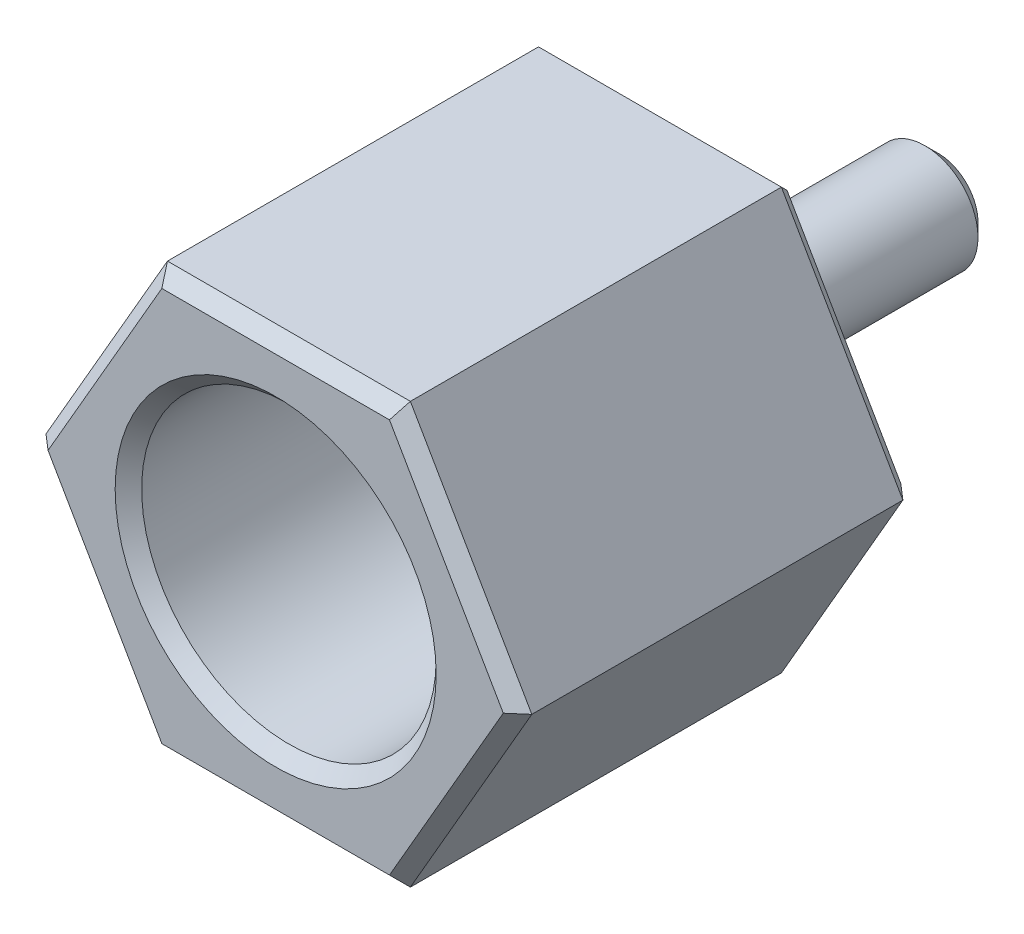
ISO-10303-21;
HEADER;
FILE_DESCRIPTION(('STEP AP214'),'2;1');
FILE_NAME('part.step','',(''),(''),'','','');
FILE_SCHEMA(('AUTOMOTIVE_DESIGN { 1 0 10303 214 1 1 1 1 }'));
ENDSEC;
DATA;
#1=APPLICATION_CONTEXT('core data for automotive mechanical design processes');
#2=APPLICATION_PROTOCOL_DEFINITION('international standard','automotive_design',2000,#1);
#3=PRODUCT_CONTEXT('',#1,'mechanical');
#4=PRODUCT('Part','Part','',(#3));
#5=PRODUCT_RELATED_PRODUCT_CATEGORY('part','',(#4));
#6=PRODUCT_DEFINITION_FORMATION('','',#4);
#7=PRODUCT_DEFINITION_CONTEXT('part definition',#1,'design');
#8=PRODUCT_DEFINITION('design','',#6,#7);
#9=PRODUCT_DEFINITION_SHAPE('','',#8);
#10=(LENGTH_UNIT() NAMED_UNIT(*) SI_UNIT(.MILLI.,.METRE.));
#11=(NAMED_UNIT(*) PLANE_ANGLE_UNIT() SI_UNIT($,.RADIAN.));
#12=(NAMED_UNIT(*) SI_UNIT($,.STERADIAN.) SOLID_ANGLE_UNIT());
#13=UNCERTAINTY_MEASURE_WITH_UNIT(LENGTH_MEASURE(1.E-05),#10,'distance_accuracy_value','');
#14=(GEOMETRIC_REPRESENTATION_CONTEXT(3) GLOBAL_UNCERTAINTY_ASSIGNED_CONTEXT((#13)) GLOBAL_UNIT_ASSIGNED_CONTEXT((#10,
#11,#12)) REPRESENTATION_CONTEXT('',''));
#15=CARTESIAN_POINT('',(0.,0.,0.));
#16=DIRECTION('',(0.,0.,1.));
#17=DIRECTION('',(1.,0.,0.));
#18=AXIS2_PLACEMENT_3D('',#15,#16,#17);
#19=CARTESIAN_POINT('',(0.,0.,0.));
#20=DIRECTION('',(0.,0.,1.));
#21=DIRECTION('',(1.,0.,0.));
#22=AXIS2_PLACEMENT_3D('',#19,#20,#21);
#23=CYLINDRICAL_SURFACE('',#22,1.);
#24=CARTESIAN_POINT('',(0.,0.,-12.));
#25=DIRECTION('',(0.,0.,1.));
#26=DIRECTION('',(1.,0.,0.));
#27=AXIS2_PLACEMENT_3D('',#24,#25,#26);
#28=CIRCLE('',#27,1.);
#29=CARTESIAN_POINT('',(1.,0.,-12.));
#30=VERTEX_POINT('',#29);
#31=EDGE_CURVE('E258',#30,#30,#28,.T.);
#32=ORIENTED_EDGE('',*,*,#31,.T.);
#33=EDGE_LOOP('',(#32));
#34=FACE_BOUND('',#33,.T.);
#35=CARTESIAN_POINT('',(0.,0.,-25.));
#36=DIRECTION('',(0.,0.,1.));
#37=DIRECTION('',(1.,0.,0.));
#38=AXIS2_PLACEMENT_3D('',#35,#36,#37);
#39=CIRCLE('',#38,1.);
#40=CARTESIAN_POINT('',(1.,0.,-25.));
#41=VERTEX_POINT('',#40);
#42=EDGE_CURVE('E268',#41,#41,#39,.T.);
#43=ORIENTED_EDGE('',*,*,#42,.F.);
#44=EDGE_LOOP('',(#43));
#45=FACE_BOUND('',#44,.T.);
#46=ADVANCED_FACE('F35',(#34,#45),#23,.F.);
#47=CARTESIAN_POINT('',(1.,0.,-25.));
#48=DIRECTION('',(0.,0.,-1.));
#49=DIRECTION('',(-1.,0.,0.));
#50=AXIS2_PLACEMENT_3D('',#47,#48,#49);
#51=PLANE('',#50);
#52=CARTESIAN_POINT('',(0.,0.,-25.));
#53=DIRECTION('',(0.,0.,-1.));
#54=DIRECTION('',(-1.,0.,0.));
#55=AXIS2_PLACEMENT_3D('',#52,#53,#54);
#56=CIRCLE('',#55,1.5);
#57=CARTESIAN_POINT('',(-1.5,0.,-25.));
#58=VERTEX_POINT('',#57);
#59=EDGE_CURVE('E11',#58,#58,#56,.T.);
#60=ORIENTED_EDGE('',*,*,#59,.T.);
#61=EDGE_LOOP('',(#60));
#62=FACE_BOUND('',#61,.T.);
#63=ORIENTED_EDGE('',*,*,#42,.T.);
#64=EDGE_LOOP('',(#63));
#65=FACE_BOUND('',#64,.T.);
#66=ADVANCED_FACE('F320',(#62,#65),#51,.T.);
#67=CARTESIAN_POINT('',(0.,0.,0.));
#68=DIRECTION('',(0.,0.,1.));
#69=DIRECTION('',(1.,0.,0.));
#70=AXIS2_PLACEMENT_3D('',#67,#68,#69);
#71=CYLINDRICAL_SURFACE('',#70,2.);
#72=CARTESIAN_POINT('',(0.,0.,-24.5));
#73=DIRECTION('',(0.,0.,-1.));
#74=DIRECTION('',(-1.,0.,0.));
#75=AXIS2_PLACEMENT_3D('',#72,#73,#74);
#76=CIRCLE('',#75,2.);
#77=CARTESIAN_POINT('',(-2.,0.,-24.5));
#78=VERTEX_POINT('',#77);
#79=EDGE_CURVE('E45',#78,#78,#76,.F.);
#80=ORIENTED_EDGE('',*,*,#79,.T.);
#81=EDGE_LOOP('',(#80));
#82=FACE_BOUND('',#81,.T.);
#83=CARTESIAN_POINT('',(0.,0.,-15.));
#84=DIRECTION('',(0.,0.,1.));
#85=DIRECTION('',(1.,0.,0.));
#86=AXIS2_PLACEMENT_3D('',#83,#84,#85);
#87=CIRCLE('',#86,2.);
#88=CARTESIAN_POINT('',(2.,0.,-15.));
#89=VERTEX_POINT('',#88);
#90=EDGE_CURVE('E265',#89,#89,#87,.T.);
#91=ORIENTED_EDGE('',*,*,#90,.F.);
#92=EDGE_LOOP('',(#91));
#93=FACE_BOUND('',#92,.T.);
#94=ADVANCED_FACE('F326',(#82,#93),#71,.T.);
#95=CARTESIAN_POINT('',(2.,0.,-15.));
#96=DIRECTION('',(0.,0.,-1.));
#97=DIRECTION('',(-1.,0.,0.));
#98=AXIS2_PLACEMENT_3D('',#95,#96,#97);
#99=PLANE('',#98);
#100=DIRECTION('',(-1.,0.,0.));
#101=VECTOR('',#100,1.);
#102=CARTESIAN_POINT('',(2.,-7.4375,-15.));
#103=LINE('',#102,#101);
#104=CARTESIAN_POINT('',(4.29404262709783,-7.4375,-15.));
#105=VERTEX_POINT('',#104);
#106=CARTESIAN_POINT('',(-4.29404262709784,-7.43749999999999,-15.));
#107=VERTEX_POINT('',#106);
#108=EDGE_CURVE('E188',#105,#107,#103,.T.);
#109=ORIENTED_EDGE('',*,*,#108,.T.);
#110=DIRECTION('',(-0.499999999999999,0.866025403784439,0.));
#111=VECTOR('',#110,1.);
#112=CARTESIAN_POINT('',(-5.94106394064676,-4.58477540378443,-15.));
#113=LINE('',#112,#111);
#114=CARTESIAN_POINT('',(-8.58808525419567,0.,-15.));
#115=VERTEX_POINT('',#114);
#116=EDGE_CURVE('E197',#107,#115,#113,.T.);
#117=ORIENTED_EDGE('',*,*,#116,.T.);
#118=DIRECTION('',(0.5,0.866025403784438,0.));
#119=VECTOR('',#118,1.);
#120=CARTESIAN_POINT('',(-5.94106394064675,4.58477540378444,-15.));
#121=LINE('',#120,#119);
#122=CARTESIAN_POINT('',(-4.29404262709784,7.43749999999999,-15.));
#123=VERTEX_POINT('',#122);
#124=EDGE_CURVE('E60',#115,#123,#121,.T.);
#125=ORIENTED_EDGE('',*,*,#124,.T.);
#126=DIRECTION('',(1.,0.,0.));
#127=VECTOR('',#126,1.);
#128=CARTESIAN_POINT('',(2.,7.43749999999999,-15.));
#129=LINE('',#128,#127);
#130=CARTESIAN_POINT('',(4.29404262709784,7.43749999999999,-15.));
#131=VERTEX_POINT('',#130);
#132=EDGE_CURVE('E194',#123,#131,#129,.T.);
#133=ORIENTED_EDGE('',*,*,#132,.T.);
#134=DIRECTION('',(0.499999999999999,-0.866025403784439,0.));
#135=VECTOR('',#134,1.);
#136=CARTESIAN_POINT('',(6.94106394064676,2.85272459621555,-15.));
#137=LINE('',#136,#135);
#138=CARTESIAN_POINT('',(8.58808525419567,0.,-15.));
#139=VERTEX_POINT('',#138);
#140=EDGE_CURVE('E192',#131,#139,#137,.T.);
#141=ORIENTED_EDGE('',*,*,#140,.T.);
#142=DIRECTION('',(-0.5,-0.866025403784439,0.));
#143=VECTOR('',#142,1.);
#144=CARTESIAN_POINT('',(6.94106394064676,-2.85272459621556,-15.));
#145=LINE('',#144,#143);
#146=EDGE_CURVE('E190',#139,#105,#145,.T.);
#147=ORIENTED_EDGE('',*,*,#146,.T.);
#148=EDGE_LOOP('',(#109,#117,#125,#133,#141,#147));
#149=FACE_BOUND('',#148,.T.);
#150=ORIENTED_EDGE('',*,*,#90,.T.);
#151=EDGE_LOOP('',(#150));
#152=FACE_BOUND('',#151,.T.);
#153=ADVANCED_FACE('F304',(#149,#152),#99,.T.);
#154=CARTESIAN_POINT('',(7.9375,0.,0.));
#155=DIRECTION('',(0.,0.,1.));
#156=DIRECTION('',(1.,0.,0.));
#157=AXIS2_PLACEMENT_3D('',#154,#155,#156);
#158=PLANE('',#157);
#159=CARTESIAN_POINT('',(0.,0.,0.));
#160=DIRECTION('',(0.,0.,1.));
#161=DIRECTION('',(1.,0.,0.));
#162=AXIS2_PLACEMENT_3D('',#159,#160,#161);
#163=CIRCLE('',#162,6.05625000000001);
#164=CARTESIAN_POINT('',(6.05625000000001,0.,0.));
#165=VERTEX_POINT('',#164);
#166=EDGE_CURVE('E156',#165,#165,#163,.F.);
#167=ORIENTED_EDGE('',*,*,#166,.T.);
#168=EDGE_LOOP('',(#167));
#169=FACE_BOUND('',#168,.T.);
#170=DIRECTION('',(1.,0.,0.));
#171=VECTOR('',#170,1.);
#172=CARTESIAN_POINT('',(7.9375,-7.4375,0.));
#173=LINE('',#172,#171);
#174=CARTESIAN_POINT('',(-4.29404262709784,-7.43749999999999,0.));
#175=VERTEX_POINT('',#174);
#176=CARTESIAN_POINT('',(4.29404262709784,-7.43749999999999,0.));
#177=VERTEX_POINT('',#176);
#178=EDGE_CURVE('E155',#175,#177,#173,.T.);
#179=ORIENTED_EDGE('',*,*,#178,.T.);
#180=DIRECTION('',(0.5,0.866025403784439,0.));
#181=VECTOR('',#180,1.);
#182=CARTESIAN_POINT('',(8.42543894064676,-0.281711678730506,0.));
#183=LINE('',#182,#181);
#184=CARTESIAN_POINT('',(8.58808525419567,0.,0.));
#185=VERTEX_POINT('',#184);
#186=EDGE_CURVE('E134',#177,#185,#183,.T.);
#187=ORIENTED_EDGE('',*,*,#186,.T.);
#188=DIRECTION('',(-0.499999999999999,0.866025403784439,0.));
#189=VECTOR('',#188,1.);
#190=CARTESIAN_POINT('',(8.42543894064675,0.281711678730503,0.));
#191=LINE('',#190,#189);
#192=CARTESIAN_POINT('',(4.29404262709784,7.43749999999999,0.));
#193=VERTEX_POINT('',#192);
#194=EDGE_CURVE('E144',#185,#193,#191,.T.);
#195=ORIENTED_EDGE('',*,*,#194,.T.);
#196=DIRECTION('',(-1.,0.,0.));
#197=VECTOR('',#196,1.);
#198=CARTESIAN_POINT('',(7.9375,7.43749999999999,0.));
#199=LINE('',#198,#197);
#200=CARTESIAN_POINT('',(-4.29404262709784,7.43749999999999,0.));
#201=VERTEX_POINT('',#200);
#202=EDGE_CURVE('E150',#193,#201,#199,.T.);
#203=ORIENTED_EDGE('',*,*,#202,.T.);
#204=DIRECTION('',(-0.5,-0.866025403784438,0.));
#205=VECTOR('',#204,1.);
#206=CARTESIAN_POINT('',(-4.45668894064675,7.15578832126949,0.));
#207=LINE('',#206,#205);
#208=CARTESIAN_POINT('',(-8.58808525419568,0.,0.));
#209=VERTEX_POINT('',#208);
#210=EDGE_CURVE('E274',#201,#209,#207,.T.);
#211=ORIENTED_EDGE('',*,*,#210,.T.);
#212=DIRECTION('',(0.499999999999999,-0.866025403784439,0.));
#213=VECTOR('',#212,1.);
#214=CARTESIAN_POINT('',(-4.45668894064677,-7.15578832126948,0.));
#215=LINE('',#214,#213);
#216=EDGE_CURVE('E161',#209,#175,#215,.T.);
#217=ORIENTED_EDGE('',*,*,#216,.T.);
#218=EDGE_LOOP('',(#179,#187,#195,#203,#211,#217));
#219=FACE_BOUND('',#218,.T.);
#220=ADVANCED_FACE('F153',(#169,#219),#158,.T.);
#221=CARTESIAN_POINT('',(0.,0.,0.));
#222=DIRECTION('',(0.,0.,1.));
#223=DIRECTION('',(1.,0.,0.));
#224=AXIS2_PLACEMENT_3D('',#221,#222,#223);
#225=CYLINDRICAL_SURFACE('',#224,5.55625);
#226=CARTESIAN_POINT('',(0.,0.,-0.500000000000012));
#227=DIRECTION('',(0.,0.,1.));
#228=DIRECTION('',(1.,0.,0.));
#229=AXIS2_PLACEMENT_3D('',#226,#227,#228);
#230=CIRCLE('',#229,5.55625);
#231=CARTESIAN_POINT('',(5.55625,0.,-0.500000000000012));
#232=VERTEX_POINT('',#231);
#233=EDGE_CURVE('E151',#232,#232,#230,.T.);
#234=ORIENTED_EDGE('',*,*,#233,.T.);
#235=EDGE_LOOP('',(#234));
#236=FACE_BOUND('',#235,.T.);
#237=CARTESIAN_POINT('',(0.,0.,-12.));
#238=DIRECTION('',(0.,0.,1.));
#239=DIRECTION('',(1.,0.,0.));
#240=AXIS2_PLACEMENT_3D('',#237,#238,#239);
#241=CIRCLE('',#240,5.55625);
#242=CARTESIAN_POINT('',(5.55625,0.,-12.));
#243=VERTEX_POINT('',#242);
#244=EDGE_CURVE('E261',#243,#243,#241,.T.);
#245=ORIENTED_EDGE('',*,*,#244,.F.);
#246=EDGE_LOOP('',(#245));
#247=FACE_BOUND('',#246,.T.);
#248=ADVANCED_FACE('F443',(#236,#247),#225,.F.);
#249=CARTESIAN_POINT('',(5.55625,0.,-12.));
#250=DIRECTION('',(0.,0.,1.));
#251=DIRECTION('',(1.,0.,0.));
#252=AXIS2_PLACEMENT_3D('',#249,#250,#251);
#253=PLANE('',#252);
#254=ORIENTED_EDGE('',*,*,#244,.T.);
#255=EDGE_LOOP('',(#254));
#256=FACE_BOUND('',#255,.T.);
#257=ORIENTED_EDGE('',*,*,#31,.F.);
#258=EDGE_LOOP('',(#257));
#259=FACE_BOUND('',#258,.T.);
#260=ADVANCED_FACE('F449',(#256,#259),#253,.T.);
#261=CARTESIAN_POINT('',(-4.58271776169266,-7.9375,0.));
#262=DIRECTION('',(-0.866025403784439,-0.499999999999999,0.));
#263=DIRECTION('',(0.499999999999999,-0.866025403784439,0.));
#264=AXIS2_PLACEMENT_3D('',#261,#262,#263);
#265=PLANE('',#264);
#266=DIRECTION('',(0.,0.,-1.));
#267=VECTOR('',#266,1.);
#268=CARTESIAN_POINT('',(-4.58271776169266,-7.9375,0.));
#269=LINE('',#268,#267);
#270=CARTESIAN_POINT('',(-4.58271776169266,-7.9375,-0.500000000000004));
#271=VERTEX_POINT('',#270);
#272=CARTESIAN_POINT('',(-4.58271776169266,-7.9375,-14.5));
#273=VERTEX_POINT('',#272);
#274=EDGE_CURVE('E262',#271,#273,#269,.T.);
#275=ORIENTED_EDGE('',*,*,#274,.F.);
#276=DIRECTION('',(-0.499999999999999,0.866025403784439,0.));
#277=VECTOR('',#276,1.);
#278=CARTESIAN_POINT('',(-4.58271776169266,-7.9375,-0.500000000000004));
#279=LINE('',#278,#277);
#280=CARTESIAN_POINT('',(-9.16543552338531,0.,-0.500000000000003));
#281=VERTEX_POINT('',#280);
#282=EDGE_CURVE('E174',#271,#281,#279,.T.);
#283=ORIENTED_EDGE('',*,*,#282,.T.);
#284=DIRECTION('',(0.,0.,-1.));
#285=VECTOR('',#284,1.);
#286=CARTESIAN_POINT('',(-9.16543552338531,0.,0.));
#287=LINE('',#286,#285);
#288=CARTESIAN_POINT('',(-9.16543552338531,0.,-14.5));
#289=VERTEX_POINT('',#288);
#290=EDGE_CURVE('E211',#281,#289,#287,.T.);
#291=ORIENTED_EDGE('',*,*,#290,.T.);
#292=DIRECTION('',(0.499999999999999,-0.866025403784439,0.));
#293=VECTOR('',#292,1.);
#294=CARTESIAN_POINT('',(-4.58271776169266,-7.9375,-14.5));
#295=LINE('',#294,#293);
#296=EDGE_CURVE('E171',#289,#273,#295,.T.);
#297=ORIENTED_EDGE('',*,*,#296,.T.);
#298=EDGE_LOOP('',(#275,#283,#291,#297));
#299=FACE_BOUND('',#298,.T.);
#300=ADVANCED_FACE('F296',(#299),#265,.T.);
#301=CARTESIAN_POINT('',(4.58271776169265,-7.9375,0.));
#302=DIRECTION('',(0.,-1.,0.));
#303=DIRECTION('',(1.,0.,0.));
#304=AXIS2_PLACEMENT_3D('',#301,#302,#303);
#305=PLANE('',#304);
#306=DIRECTION('',(0.,0.,-1.));
#307=VECTOR('',#306,1.);
#308=CARTESIAN_POINT('',(4.58271776169265,-7.9375,0.));
#309=LINE('',#308,#307);
#310=CARTESIAN_POINT('',(4.58271776169265,-7.9375,-0.500000000000004));
#311=VERTEX_POINT('',#310);
#312=CARTESIAN_POINT('',(4.58271776169265,-7.9375,-14.5));
#313=VERTEX_POINT('',#312);
#314=EDGE_CURVE('E251',#311,#313,#309,.T.);
#315=ORIENTED_EDGE('',*,*,#314,.F.);
#316=DIRECTION('',(-1.,0.,0.));
#317=VECTOR('',#316,1.);
#318=CARTESIAN_POINT('',(4.58271776169265,-7.9375,-0.500000000000004));
#319=LINE('',#318,#317);
#320=EDGE_CURVE('E169',#311,#271,#319,.T.);
#321=ORIENTED_EDGE('',*,*,#320,.T.);
#322=ORIENTED_EDGE('',*,*,#274,.T.);
#323=DIRECTION('',(1.,0.,0.));
#324=VECTOR('',#323,1.);
#325=CARTESIAN_POINT('',(4.58271776169265,-7.9375,-14.5));
#326=LINE('',#325,#324);
#327=EDGE_CURVE('E167',#273,#313,#326,.T.);
#328=ORIENTED_EDGE('',*,*,#327,.T.);
#329=EDGE_LOOP('',(#315,#321,#322,#328));
#330=FACE_BOUND('',#329,.T.);
#331=ADVANCED_FACE('F292',(#330),#305,.T.);
#332=CARTESIAN_POINT('',(9.1654355233853,0.,0.));
#333=DIRECTION('',(0.866025403784438,-0.5,0.));
#334=DIRECTION('',(0.5,0.866025403784439,0.));
#335=AXIS2_PLACEMENT_3D('',#332,#333,#334);
#336=PLANE('',#335);
#337=DIRECTION('',(0.,0.,-1.));
#338=VECTOR('',#337,1.);
#339=CARTESIAN_POINT('',(9.1654355233853,0.,0.));
#340=LINE('',#339,#338);
#341=CARTESIAN_POINT('',(9.1654355233853,0.,-0.500000000000004));
#342=VERTEX_POINT('',#341);
#343=CARTESIAN_POINT('',(9.1654355233853,0.,-14.5));
#344=VERTEX_POINT('',#343);
#345=EDGE_CURVE('E243',#342,#344,#340,.T.);
#346=ORIENTED_EDGE('',*,*,#345,.F.);
#347=DIRECTION('',(-0.5,-0.866025403784439,0.));
#348=VECTOR('',#347,1.);
#349=CARTESIAN_POINT('',(9.1654355233853,0.,-0.500000000000004));
#350=LINE('',#349,#348);
#351=EDGE_CURVE('E137',#342,#311,#350,.T.);
#352=ORIENTED_EDGE('',*,*,#351,.T.);
#353=ORIENTED_EDGE('',*,*,#314,.T.);
#354=DIRECTION('',(0.5,0.866025403784439,0.));
#355=VECTOR('',#354,1.);
#356=CARTESIAN_POINT('',(9.1654355233853,0.,-14.5));
#357=LINE('',#356,#355);
#358=EDGE_CURVE('E159',#313,#344,#357,.T.);
#359=ORIENTED_EDGE('',*,*,#358,.T.);
#360=EDGE_LOOP('',(#346,#352,#353,#359));
#361=FACE_BOUND('',#360,.T.);
#362=ADVANCED_FACE('F291',(#361),#336,.T.);
#363=CARTESIAN_POINT('',(4.58271776169266,7.9375,0.));
#364=DIRECTION('',(0.866025403784439,0.499999999999999,0.));
#365=DIRECTION('',(-0.499999999999999,0.866025403784439,0.));
#366=AXIS2_PLACEMENT_3D('',#363,#364,#365);
#367=PLANE('',#366);
#368=DIRECTION('',(0.,0.,-1.));
#369=VECTOR('',#368,1.);
#370=CARTESIAN_POINT('',(4.58271776169266,7.9375,0.));
#371=LINE('',#370,#369);
#372=CARTESIAN_POINT('',(4.58271776169266,7.9375,-0.500000000000004));
#373=VERTEX_POINT('',#372);
#374=CARTESIAN_POINT('',(4.58271776169266,7.9375,-14.5));
#375=VERTEX_POINT('',#374);
#376=EDGE_CURVE('E241',#373,#375,#371,.T.);
#377=ORIENTED_EDGE('',*,*,#376,.F.);
#378=DIRECTION('',(0.499999999999999,-0.866025403784439,0.));
#379=VECTOR('',#378,1.);
#380=CARTESIAN_POINT('',(4.58271776169266,7.9375,-0.500000000000004));
#381=LINE('',#380,#379);
#382=EDGE_CURVE('E186',#373,#342,#381,.T.);
#383=ORIENTED_EDGE('',*,*,#382,.T.);
#384=ORIENTED_EDGE('',*,*,#345,.T.);
#385=DIRECTION('',(-0.499999999999999,0.866025403784439,0.));
#386=VECTOR('',#385,1.);
#387=CARTESIAN_POINT('',(4.58271776169266,7.9375,-14.5));
#388=LINE('',#387,#386);
#389=EDGE_CURVE('E184',#344,#375,#388,.T.);
#390=ORIENTED_EDGE('',*,*,#389,.T.);
#391=EDGE_LOOP('',(#377,#383,#384,#390));
#392=FACE_BOUND('',#391,.T.);
#393=ADVANCED_FACE('F240',(#392),#367,.T.);
#394=CARTESIAN_POINT('',(-4.58271776169265,7.9375,0.));
#395=DIRECTION('',(0.,1.,0.));
#396=DIRECTION('',(-1.,0.,0.));
#397=AXIS2_PLACEMENT_3D('',#394,#395,#396);
#398=PLANE('',#397);
#399=DIRECTION('',(0.,0.,-1.));
#400=VECTOR('',#399,1.);
#401=CARTESIAN_POINT('',(-4.58271776169265,7.9375,0.));
#402=LINE('',#401,#400);
#403=CARTESIAN_POINT('',(-4.58271776169265,7.9375,-0.500000000000004));
#404=VERTEX_POINT('',#403);
#405=CARTESIAN_POINT('',(-4.58271776169265,7.9375,-14.5));
#406=VERTEX_POINT('',#405);
#407=EDGE_CURVE('E249',#404,#406,#402,.T.);
#408=ORIENTED_EDGE('',*,*,#407,.F.);
#409=DIRECTION('',(1.,0.,0.));
#410=VECTOR('',#409,1.);
#411=CARTESIAN_POINT('',(-4.58271776169265,7.9375,-0.500000000000004));
#412=LINE('',#411,#410);
#413=EDGE_CURVE('E182',#404,#373,#412,.T.);
#414=ORIENTED_EDGE('',*,*,#413,.T.);
#415=ORIENTED_EDGE('',*,*,#376,.T.);
#416=DIRECTION('',(-1.,0.,0.));
#417=VECTOR('',#416,1.);
#418=CARTESIAN_POINT('',(-4.58271776169265,7.9375,-14.5));
#419=LINE('',#418,#417);
#420=EDGE_CURVE('E180',#375,#406,#419,.T.);
#421=ORIENTED_EDGE('',*,*,#420,.T.);
#422=EDGE_LOOP('',(#408,#414,#415,#421));
#423=FACE_BOUND('',#422,.T.);
#424=ADVANCED_FACE('F246',(#423),#398,.T.);
#425=CARTESIAN_POINT('',(-9.16543552338531,0.,0.));
#426=DIRECTION('',(-0.866025403784438,0.5,0.));
#427=DIRECTION('',(-0.5,-0.866025403784439,0.));
#428=AXIS2_PLACEMENT_3D('',#425,#426,#427);
#429=PLANE('',#428);
#430=ORIENTED_EDGE('',*,*,#290,.F.);
#431=DIRECTION('',(0.5,0.866025403784439,0.));
#432=VECTOR('',#431,1.);
#433=CARTESIAN_POINT('',(-9.16543552338531,0.,-0.500000000000003));
#434=LINE('',#433,#432);
#435=EDGE_CURVE('E178',#281,#404,#434,.T.);
#436=ORIENTED_EDGE('',*,*,#435,.T.);
#437=ORIENTED_EDGE('',*,*,#407,.T.);
#438=DIRECTION('',(-0.5,-0.866025403784439,0.));
#439=VECTOR('',#438,1.);
#440=CARTESIAN_POINT('',(-9.16543552338531,0.,-14.5));
#441=LINE('',#440,#439);
#442=EDGE_CURVE('E176',#406,#289,#441,.T.);
#443=ORIENTED_EDGE('',*,*,#442,.T.);
#444=EDGE_LOOP('',(#430,#436,#437,#443));
#445=FACE_BOUND('',#444,.T.);
#446=ADVANCED_FACE('F340',(#445),#429,.T.);
#447=CARTESIAN_POINT('',(0.,0.,-0.500000000000012));
#448=DIRECTION('',(0.,0.,1.));
#449=DIRECTION('',(1.,0.,0.));
#450=AXIS2_PLACEMENT_3D('',#447,#448,#449);
#451=CONICAL_SURFACE('',#450,5.55625,0.785398163397447);
#452=ORIENTED_EDGE('',*,*,#166,.F.);
#453=EDGE_LOOP('',(#452));
#454=FACE_BOUND('',#453,.T.);
#455=ORIENTED_EDGE('',*,*,#233,.F.);
#456=EDGE_LOOP('',(#455));
#457=FACE_BOUND('',#456,.T.);
#458=ADVANCED_FACE('F333',(#454,#457),#451,.F.);
#459=CARTESIAN_POINT('',(-9.16543552338531,0.,-0.500000000000004));
#460=DIRECTION('',(0.612372435695795,-0.353553390593274,-0.707106781186547));
#461=DIRECTION('',(0.5,0.866025403784439,0.));
#462=AXIS2_PLACEMENT_3D('',#459,#460,#461);
#463=PLANE('',#462);
#464=DIRECTION('',(0.755928946018454,0.,0.654653670707978));
#465=VECTOR('',#464,1.);
#466=CARTESIAN_POINT('',(-9.16543552338531,0.,-0.500000000000004));
#467=LINE('',#466,#465);
#468=EDGE_CURVE('E205',#209,#281,#467,.F.);
#469=ORIENTED_EDGE('',*,*,#468,.F.);
#470=ORIENTED_EDGE('',*,*,#210,.F.);
#471=DIRECTION('',(0.377964473009224,-0.654653670707979,0.654653670707977));
#472=VECTOR('',#471,1.);
#473=CARTESIAN_POINT('',(-4.58271776169265,7.9375,-0.500000000000004));
#474=LINE('',#473,#472);
#475=EDGE_CURVE('E208',#404,#201,#474,.T.);
#476=ORIENTED_EDGE('',*,*,#475,.F.);
#477=ORIENTED_EDGE('',*,*,#435,.F.);
#478=EDGE_LOOP('',(#469,#470,#476,#477));
#479=FACE_BOUND('',#478,.T.);
#480=ADVANCED_FACE('F339',(#479),#463,.F.);
#481=CARTESIAN_POINT('',(-4.58271776169265,7.9375,-0.500000000000004));
#482=DIRECTION('',(0.,-0.707106781186546,-0.707106781186549));
#483=DIRECTION('',(1.,0.,0.));
#484=AXIS2_PLACEMENT_3D('',#481,#482,#483);
#485=PLANE('',#484);
#486=ORIENTED_EDGE('',*,*,#475,.T.);
#487=ORIENTED_EDGE('',*,*,#202,.F.);
#488=DIRECTION('',(-0.377964473009227,-0.654653670707978,0.654653670707976));
#489=VECTOR('',#488,1.);
#490=CARTESIAN_POINT('',(4.58271776169266,7.9375,-0.500000000000004));
#491=LINE('',#490,#489);
#492=EDGE_CURVE('E147',#373,#193,#491,.T.);
#493=ORIENTED_EDGE('',*,*,#492,.F.);
#494=ORIENTED_EDGE('',*,*,#413,.F.);
#495=EDGE_LOOP('',(#486,#487,#493,#494));
#496=FACE_BOUND('',#495,.T.);
#497=ADVANCED_FACE('F364',(#496),#485,.F.);
#498=CARTESIAN_POINT('',(-4.58271776169266,-7.9375,-0.500000000000004));
#499=DIRECTION('',(0.612372435695796,0.353553390593274,-0.707106781186546));
#500=DIRECTION('',(-0.499999999999999,0.866025403784439,0.));
#501=AXIS2_PLACEMENT_3D('',#498,#499,#500);
#502=PLANE('',#501);
#503=ORIENTED_EDGE('',*,*,#468,.T.);
#504=ORIENTED_EDGE('',*,*,#282,.F.);
#505=DIRECTION('',(0.377964473009223,0.654653670707979,0.654653670707977));
#506=VECTOR('',#505,1.);
#507=CARTESIAN_POINT('',(-4.58271776169266,-7.9375,-0.500000000000004));
#508=LINE('',#507,#506);
#509=EDGE_CURVE('E140',#175,#271,#508,.F.);
#510=ORIENTED_EDGE('',*,*,#509,.F.);
#511=ORIENTED_EDGE('',*,*,#216,.F.);
#512=EDGE_LOOP('',(#503,#504,#510,#511));
#513=FACE_BOUND('',#512,.T.);
#514=ADVANCED_FACE('F281',(#513),#502,.F.);
#515=CARTESIAN_POINT('',(4.58271776169266,7.9375,-0.500000000000004));
#516=DIRECTION('',(-0.612372435695794,-0.353553390593273,-0.707106781186548));
#517=DIRECTION('',(0.499999999999999,-0.866025403784439,0.));
#518=AXIS2_PLACEMENT_3D('',#515,#516,#517);
#519=PLANE('',#518);
#520=ORIENTED_EDGE('',*,*,#492,.T.);
#521=ORIENTED_EDGE('',*,*,#194,.F.);
#522=DIRECTION('',(0.755928946018455,0.,-0.654653670707977));
#523=VECTOR('',#522,1.);
#524=CARTESIAN_POINT('',(6.54673965956094,0.,1.76785714285713));
#525=LINE('',#524,#523);
#526=EDGE_CURVE('E130',#342,#185,#525,.F.);
#527=ORIENTED_EDGE('',*,*,#526,.F.);
#528=ORIENTED_EDGE('',*,*,#382,.F.);
#529=EDGE_LOOP('',(#520,#521,#527,#528));
#530=FACE_BOUND('',#529,.T.);
#531=ADVANCED_FACE('F145',(#530),#519,.F.);
#532=CARTESIAN_POINT('',(4.58271776169265,-7.9375,-0.500000000000004));
#533=DIRECTION('',(0.,0.707106781186546,-0.707106781186549));
#534=DIRECTION('',(-1.,0.,0.));
#535=AXIS2_PLACEMENT_3D('',#532,#533,#534);
#536=PLANE('',#535);
#537=ORIENTED_EDGE('',*,*,#509,.T.);
#538=ORIENTED_EDGE('',*,*,#320,.F.);
#539=DIRECTION('',(-0.377964473009226,0.654653670707979,0.654653670707977));
#540=VECTOR('',#539,1.);
#541=CARTESIAN_POINT('',(4.58271776169265,-7.9375,-0.500000000000004));
#542=LINE('',#541,#540);
#543=EDGE_CURVE('E141',#177,#311,#542,.F.);
#544=ORIENTED_EDGE('',*,*,#543,.F.);
#545=ORIENTED_EDGE('',*,*,#178,.F.);
#546=EDGE_LOOP('',(#537,#538,#544,#545));
#547=FACE_BOUND('',#546,.T.);
#548=ADVANCED_FACE('F284',(#547),#536,.F.);
#549=CARTESIAN_POINT('',(9.1654355233853,0.,-0.500000000000004));
#550=DIRECTION('',(-0.612372435695794,0.353553390593274,-0.707106781186548));
#551=DIRECTION('',(-0.5,-0.866025403784439,0.));
#552=AXIS2_PLACEMENT_3D('',#549,#550,#551);
#553=PLANE('',#552);
#554=ORIENTED_EDGE('',*,*,#526,.T.);
#555=ORIENTED_EDGE('',*,*,#186,.F.);
#556=ORIENTED_EDGE('',*,*,#543,.T.);
#557=ORIENTED_EDGE('',*,*,#351,.F.);
#558=EDGE_LOOP('',(#554,#555,#556,#557));
#559=FACE_BOUND('',#558,.T.);
#560=ADVANCED_FACE('F132',(#559),#553,.F.);
#561=CARTESIAN_POINT('',(6.94106394064676,2.85272459621555,-15.));
#562=DIRECTION('',(-0.612372435695795,-0.353553390593274,0.707106781186547));
#563=DIRECTION('',(0.499999999999999,-0.866025403784439,0.));
#564=AXIS2_PLACEMENT_3D('',#561,#562,#563);
#565=PLANE('',#564);
#566=DIRECTION('',(0.377964473009227,0.654653670707977,0.654653670707978));
#567=VECTOR('',#566,1.);
#568=CARTESIAN_POINT('',(3.53775082322672,6.1275641703473,-16.3099358296527));
#569=LINE('',#568,#567);
#570=EDGE_CURVE('E220',#375,#131,#569,.F.);
#571=ORIENTED_EDGE('',*,*,#570,.F.);
#572=ORIENTED_EDGE('',*,*,#389,.F.);
#573=DIRECTION('',(0.755928946018454,0.,0.654653670707977));
#574=VECTOR('',#573,1.);
#575=CARTESIAN_POINT('',(7.64693021788201,0.,-15.8150641703473));
#576=LINE('',#575,#574);
#577=EDGE_CURVE('E40',#139,#344,#576,.T.);
#578=ORIENTED_EDGE('',*,*,#577,.F.);
#579=ORIENTED_EDGE('',*,*,#140,.F.);
#580=EDGE_LOOP('',(#571,#572,#578,#579));
#581=FACE_BOUND('',#580,.T.);
#582=ADVANCED_FACE('F235',(#581),#565,.F.);
#583=CARTESIAN_POINT('',(6.94106394064676,-2.85272459621556,-15.));
#584=DIRECTION('',(-0.612372435695794,0.353553390593274,0.707106781186548));
#585=DIRECTION('',(-0.5,-0.866025403784439,0.));
#586=AXIS2_PLACEMENT_3D('',#583,#584,#585);
#587=PLANE('',#586);
#588=ORIENTED_EDGE('',*,*,#577,.T.);
#589=ORIENTED_EDGE('',*,*,#358,.F.);
#590=DIRECTION('',(0.377964473009228,-0.654653670707977,0.654653670707977));
#591=VECTOR('',#590,1.);
#592=CARTESIAN_POINT('',(3.96632225179814,-6.86987165930539,-15.5676283406946));
#593=LINE('',#592,#591);
#594=EDGE_CURVE('E218',#105,#313,#593,.T.);
#595=ORIENTED_EDGE('',*,*,#594,.F.);
#596=ORIENTED_EDGE('',*,*,#146,.F.);
#597=EDGE_LOOP('',(#588,#589,#595,#596));
#598=FACE_BOUND('',#597,.T.);
#599=ADVANCED_FACE('F230',(#598),#587,.F.);
#600=CARTESIAN_POINT('',(2.,7.43749999999999,-15.));
#601=DIRECTION('',(0.,-0.707106781186548,0.707106781186547));
#602=DIRECTION('',(1.,0.,0.));
#603=AXIS2_PLACEMENT_3D('',#600,#601,#602);
#604=PLANE('',#603);
#605=ORIENTED_EDGE('',*,*,#570,.T.);
#606=ORIENTED_EDGE('',*,*,#132,.F.);
#607=DIRECTION('',(-0.377964473009226,0.654653670707977,0.654653670707978));
#608=VECTOR('',#607,1.);
#609=CARTESIAN_POINT('',(-3.39489368036958,5.8801283406946,-16.5573716593054));
#610=LINE('',#609,#608);
#611=EDGE_CURVE('E215',#406,#123,#610,.F.);
#612=ORIENTED_EDGE('',*,*,#611,.F.);
#613=ORIENTED_EDGE('',*,*,#420,.F.);
#614=EDGE_LOOP('',(#605,#606,#612,#613));
#615=FACE_BOUND('',#614,.T.);
#616=ADVANCED_FACE('F310',(#615),#604,.F.);
#617=CARTESIAN_POINT('',(2.,-7.4375,-15.));
#618=DIRECTION('',(0.,0.707106781186547,0.707106781186548));
#619=DIRECTION('',(-1.,0.,0.));
#620=AXIS2_PLACEMENT_3D('',#617,#618,#619);
#621=PLANE('',#620);
#622=ORIENTED_EDGE('',*,*,#594,.T.);
#623=ORIENTED_EDGE('',*,*,#327,.F.);
#624=DIRECTION('',(0.377964473009229,0.654653670707977,-0.654653670707977));
#625=VECTOR('',#624,1.);
#626=CARTESIAN_POINT('',(-3.39489368036957,-5.8801283406946,-16.5573716593054));
#627=LINE('',#626,#625);
#628=EDGE_CURVE('E213',#107,#273,#627,.F.);
#629=ORIENTED_EDGE('',*,*,#628,.F.);
#630=ORIENTED_EDGE('',*,*,#108,.F.);
#631=EDGE_LOOP('',(#622,#623,#629,#630));
#632=FACE_BOUND('',#631,.T.);
#633=ADVANCED_FACE('F308',(#632),#621,.F.);
#634=CARTESIAN_POINT('',(-5.94106394064675,4.58477540378444,-15.));
#635=DIRECTION('',(0.612372435695795,-0.353553390593274,0.707106781186547));
#636=DIRECTION('',(0.5,0.866025403784439,0.));
#637=AXIS2_PLACEMENT_3D('',#634,#635,#636);
#638=PLANE('',#637);
#639=ORIENTED_EDGE('',*,*,#611,.T.);
#640=ORIENTED_EDGE('',*,*,#124,.F.);
#641=DIRECTION('',(-0.755928946018454,0.,0.654653670707977));
#642=VECTOR('',#641,1.);
#643=CARTESIAN_POINT('',(-7.07550164645343,0.,-16.3099358296527));
#644=LINE('',#643,#642);
#645=EDGE_CURVE('E53',#289,#115,#644,.F.);
#646=ORIENTED_EDGE('',*,*,#645,.F.);
#647=ORIENTED_EDGE('',*,*,#442,.F.);
#648=EDGE_LOOP('',(#639,#640,#646,#647));
#649=FACE_BOUND('',#648,.T.);
#650=ADVANCED_FACE('F302',(#649),#638,.F.);
#651=CARTESIAN_POINT('',(-5.94106394064676,-4.58477540378443,-15.));
#652=DIRECTION('',(0.612372435695794,0.353553390593273,0.707106781186548));
#653=DIRECTION('',(-0.499999999999999,0.866025403784439,0.));
#654=AXIS2_PLACEMENT_3D('',#651,#652,#653);
#655=PLANE('',#654);
#656=ORIENTED_EDGE('',*,*,#628,.T.);
#657=ORIENTED_EDGE('',*,*,#296,.F.);
#658=ORIENTED_EDGE('',*,*,#645,.T.);
#659=ORIENTED_EDGE('',*,*,#116,.F.);
#660=EDGE_LOOP('',(#656,#657,#658,#659));
#661=FACE_BOUND('',#660,.T.);
#662=ADVANCED_FACE('F298',(#661),#655,.F.);
#663=CARTESIAN_POINT('',(0.,0.,-24.5));
#664=DIRECTION('',(0.,0.,1.));
#665=DIRECTION('',(1.,0.,0.));
#666=AXIS2_PLACEMENT_3D('',#663,#664,#665);
#667=CONICAL_SURFACE('',#666,2.,0.785398163397451);
#668=ORIENTED_EDGE('',*,*,#59,.F.);
#669=EDGE_LOOP('',(#668));
#670=FACE_BOUND('',#669,.T.);
#671=ORIENTED_EDGE('',*,*,#79,.F.);
#672=EDGE_LOOP('',(#671));
#673=FACE_BOUND('',#672,.T.);
#674=ADVANCED_FACE('F38',(#670,#673),#667,.T.);
#675=CLOSED_SHELL('',(#46,#66,#94,#153,#220,#248,#260,#300,#331,#362,#393,#424,#446,#458,#480,
#497,#514,#531,#548,#560,#582,#599,#616,#633,#650,#662,#674));
#676=MANIFOLD_SOLID_BREP('B2',#675);
#677=ADVANCED_BREP_SHAPE_REPRESENTATION('',(#18,#676),#14);
#678=SHAPE_DEFINITION_REPRESENTATION(#9,#677);
ENDSEC;
END-ISO-10303-21;
